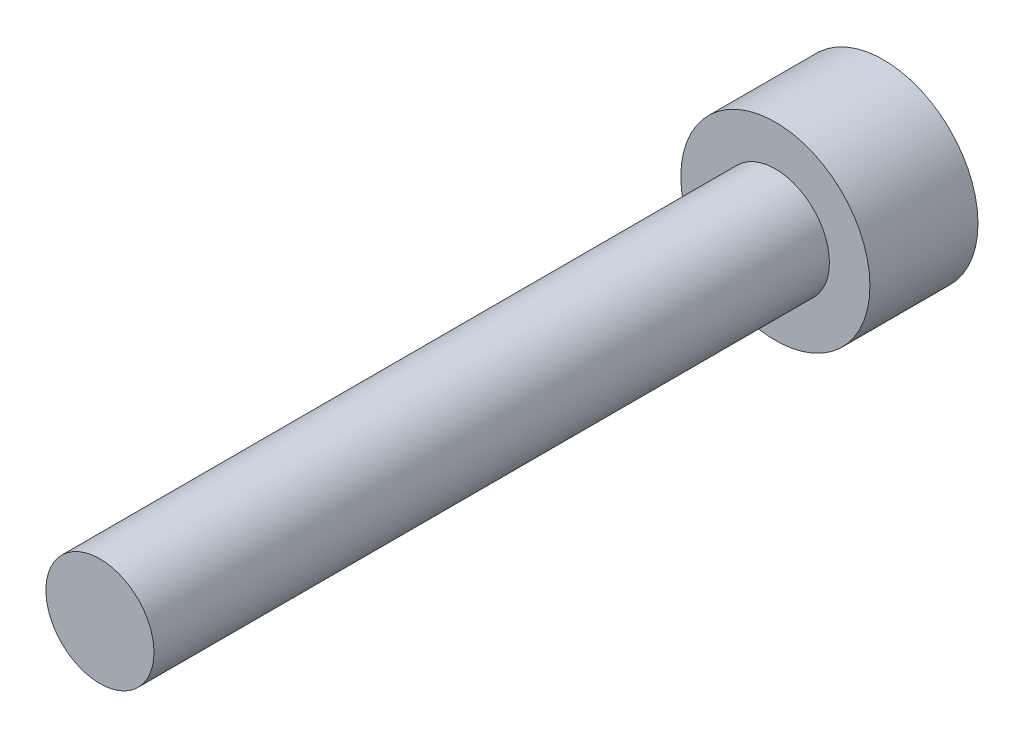
ISO-10303-21;
HEADER;
FILE_DESCRIPTION(('STEP AP214'),'2;1');
FILE_NAME('part.step','',(''),(''),'','','');
FILE_SCHEMA(('AUTOMOTIVE_DESIGN { 1 0 10303 214 1 1 1 1 }'));
ENDSEC;
DATA;
#1=APPLICATION_CONTEXT('core data for automotive mechanical design processes');
#2=APPLICATION_PROTOCOL_DEFINITION('international standard','automotive_design',2000,#1);
#3=PRODUCT_CONTEXT('',#1,'mechanical');
#4=PRODUCT('Part','Part','',(#3));
#5=PRODUCT_RELATED_PRODUCT_CATEGORY('part','',(#4));
#6=PRODUCT_DEFINITION_FORMATION('','',#4);
#7=PRODUCT_DEFINITION_CONTEXT('part definition',#1,'design');
#8=PRODUCT_DEFINITION('design','',#6,#7);
#9=PRODUCT_DEFINITION_SHAPE('','',#8);
#10=(LENGTH_UNIT() NAMED_UNIT(*) SI_UNIT(.MILLI.,.METRE.));
#11=(NAMED_UNIT(*) PLANE_ANGLE_UNIT() SI_UNIT($,.RADIAN.));
#12=(NAMED_UNIT(*) SI_UNIT($,.STERADIAN.) SOLID_ANGLE_UNIT());
#13=UNCERTAINTY_MEASURE_WITH_UNIT(LENGTH_MEASURE(1.E-05),#10,'distance_accuracy_value','');
#14=(GEOMETRIC_REPRESENTATION_CONTEXT(3) GLOBAL_UNCERTAINTY_ASSIGNED_CONTEXT((#13)) GLOBAL_UNIT_ASSIGNED_CONTEXT((#10,
#11,#12)) REPRESENTATION_CONTEXT('',''));
#15=CARTESIAN_POINT('',(0.,0.,0.));
#16=DIRECTION('',(0.,0.,1.));
#17=DIRECTION('',(1.,0.,0.));
#18=AXIS2_PLACEMENT_3D('',#15,#16,#17);
#19=CARTESIAN_POINT('',(0.,0.,25.));
#20=DIRECTION('',(0.,0.,-1.));
#21=DIRECTION('',(-1.,0.,0.));
#22=AXIS2_PLACEMENT_3D('',#19,#20,#21);
#23=CYLINDRICAL_SURFACE('',#22,2.);
#24=CARTESIAN_POINT('',(0.,0.,25.));
#25=DIRECTION('',(0.,0.,1.));
#26=DIRECTION('',(1.,0.,0.));
#27=AXIS2_PLACEMENT_3D('',#24,#25,#26);
#28=CIRCLE('',#27,2.);
#29=CARTESIAN_POINT('',(2.,0.,25.));
#30=VERTEX_POINT('',#29);
#31=EDGE_CURVE('E10',#30,#30,#28,.T.);
#32=ORIENTED_EDGE('',*,*,#31,.F.);
#33=EDGE_LOOP('',(#32));
#34=FACE_BOUND('',#33,.T.);
#35=CARTESIAN_POINT('',(0.,0.,0.));
#36=DIRECTION('',(0.,0.,1.));
#37=DIRECTION('',(1.,0.,0.));
#38=AXIS2_PLACEMENT_3D('',#35,#36,#37);
#39=CIRCLE('',#38,2.);
#40=CARTESIAN_POINT('',(2.,0.,0.));
#41=VERTEX_POINT('',#40);
#42=EDGE_CURVE('E36',#41,#41,#39,.T.);
#43=ORIENTED_EDGE('',*,*,#42,.T.);
#44=EDGE_LOOP('',(#43));
#45=FACE_BOUND('',#44,.T.);
#46=ADVANCED_FACE('F33',(#34,#45),#23,.T.);
#47=CARTESIAN_POINT('',(0.,0.,25.));
#48=DIRECTION('',(0.,0.,1.));
#49=DIRECTION('',(1.,0.,0.));
#50=AXIS2_PLACEMENT_3D('',#47,#48,#49);
#51=PLANE('',#50);
#52=ORIENTED_EDGE('',*,*,#31,.T.);
#53=EDGE_LOOP('',(#52));
#54=FACE_BOUND('',#53,.T.);
#55=ADVANCED_FACE('F56',(#54),#51,.T.);
#56=CARTESIAN_POINT('',(0.,0.,0.));
#57=DIRECTION('',(0.,0.,-1.));
#58=DIRECTION('',(-1.,0.,0.));
#59=AXIS2_PLACEMENT_3D('',#56,#57,#58);
#60=CYLINDRICAL_SURFACE('',#59,3.5);
#61=CARTESIAN_POINT('',(0.,0.,0.));
#62=DIRECTION('',(0.,0.,1.));
#63=DIRECTION('',(1.,0.,0.));
#64=AXIS2_PLACEMENT_3D('',#61,#62,#63);
#65=CIRCLE('',#64,3.5);
#66=CARTESIAN_POINT('',(3.5,0.,0.));
#67=VERTEX_POINT('',#66);
#68=EDGE_CURVE('E43',#67,#67,#65,.T.);
#69=ORIENTED_EDGE('',*,*,#68,.F.);
#70=EDGE_LOOP('',(#69));
#71=FACE_BOUND('',#70,.T.);
#72=CARTESIAN_POINT('',(0.,0.,-4.));
#73=DIRECTION('',(0.,0.,1.));
#74=DIRECTION('',(1.,0.,0.));
#75=AXIS2_PLACEMENT_3D('',#72,#73,#74);
#76=CIRCLE('',#75,3.5);
#77=CARTESIAN_POINT('',(3.5,0.,-4.));
#78=VERTEX_POINT('',#77);
#79=EDGE_CURVE('E45',#78,#78,#76,.T.);
#80=ORIENTED_EDGE('',*,*,#79,.T.);
#81=EDGE_LOOP('',(#80));
#82=FACE_BOUND('',#81,.T.);
#83=ADVANCED_FACE('F53',(#71,#82),#60,.T.);
#84=CARTESIAN_POINT('',(0.,0.,0.));
#85=DIRECTION('',(0.,0.,1.));
#86=DIRECTION('',(1.,0.,0.));
#87=AXIS2_PLACEMENT_3D('',#84,#85,#86);
#88=PLANE('',#87);
#89=ORIENTED_EDGE('',*,*,#42,.F.);
#90=EDGE_LOOP('',(#89));
#91=FACE_BOUND('',#90,.T.);
#92=ORIENTED_EDGE('',*,*,#68,.T.);
#93=EDGE_LOOP('',(#92));
#94=FACE_BOUND('',#93,.T.);
#95=ADVANCED_FACE('F51',(#91,#94),#88,.T.);
#96=CARTESIAN_POINT('',(0.,0.,-4.));
#97=DIRECTION('',(0.,0.,1.));
#98=DIRECTION('',(1.,0.,0.));
#99=AXIS2_PLACEMENT_3D('',#96,#97,#98);
#100=PLANE('',#99);
#101=ORIENTED_EDGE('',*,*,#79,.F.);
#102=EDGE_LOOP('',(#101));
#103=FACE_BOUND('',#102,.T.);
#104=ADVANCED_FACE('F60',(#103),#100,.F.);
#105=CLOSED_SHELL('',(#46,#55,#83,#95,#104));
#106=MANIFOLD_SOLID_BREP('B2',#105);
#107=ADVANCED_BREP_SHAPE_REPRESENTATION('',(#18,#106),#14);
#108=SHAPE_DEFINITION_REPRESENTATION(#9,#107);
ENDSEC;
END-ISO-10303-21;
